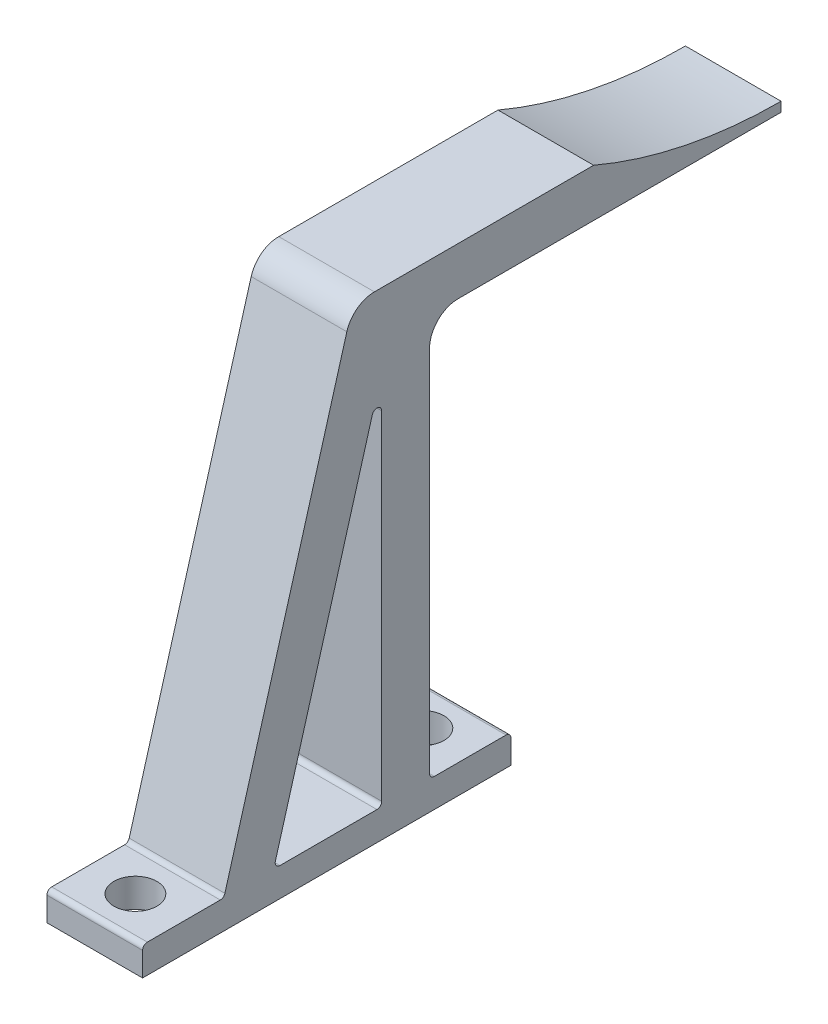
ISO-10303-21;
HEADER;
FILE_DESCRIPTION(('STEP AP214'),'2;1');
FILE_NAME('part.step','',(''),(''),'','','');
FILE_SCHEMA(('AUTOMOTIVE_DESIGN { 1 0 10303 214 1 1 1 1 }'));
ENDSEC;
DATA;
#1=APPLICATION_CONTEXT('core data for automotive mechanical design processes');
#2=APPLICATION_PROTOCOL_DEFINITION('international standard','automotive_design',2000,#1);
#3=PRODUCT_CONTEXT('',#1,'mechanical');
#4=PRODUCT('Part','Part','',(#3));
#5=PRODUCT_RELATED_PRODUCT_CATEGORY('part','',(#4));
#6=PRODUCT_DEFINITION_FORMATION('','',#4);
#7=PRODUCT_DEFINITION_CONTEXT('part definition',#1,'design');
#8=PRODUCT_DEFINITION('design','',#6,#7);
#9=PRODUCT_DEFINITION_SHAPE('','',#8);
#10=(LENGTH_UNIT() NAMED_UNIT(*) SI_UNIT(.MILLI.,.METRE.));
#11=(NAMED_UNIT(*) PLANE_ANGLE_UNIT() SI_UNIT($,.RADIAN.));
#12=(NAMED_UNIT(*) SI_UNIT($,.STERADIAN.) SOLID_ANGLE_UNIT());
#13=UNCERTAINTY_MEASURE_WITH_UNIT(LENGTH_MEASURE(1.E-05),#10,'distance_accuracy_value','');
#14=(GEOMETRIC_REPRESENTATION_CONTEXT(3) GLOBAL_UNCERTAINTY_ASSIGNED_CONTEXT((#13)) GLOBAL_UNIT_ASSIGNED_CONTEXT((#10,
#11,#12)) REPRESENTATION_CONTEXT('',''));
#15=CARTESIAN_POINT('',(0.,0.,0.));
#16=DIRECTION('',(0.,0.,1.));
#17=DIRECTION('',(1.,0.,0.));
#18=AXIS2_PLACEMENT_3D('',#15,#16,#17);
#19=CARTESIAN_POINT('',(10.,32.8701380885381,-10.8639818910002));
#20=DIRECTION('',(-1.,0.,0.));
#21=DIRECTION('',(0.,0.,1.));
#22=AXIS2_PLACEMENT_3D('',#19,#20,#21);
#23=PLANE('',#22);
#24=CARTESIAN_POINT('',(10.,32.8701380885381,-10.8639818910002));
#25=DIRECTION('',(-1.,0.,0.));
#26=DIRECTION('',(0.,0.,1.));
#27=AXIS2_PLACEMENT_3D('',#24,#25,#26);
#28=CIRCLE('',#27,3.);
#29=CARTESIAN_POINT('',(10.,33.6970501559891,-7.98019680318527));
#30=VERTEX_POINT('',#29);
#31=CARTESIAN_POINT('',(10.,35.8701380885381,-10.8639818910002));
#32=VERTEX_POINT('',#31);
#33=EDGE_CURVE('E243',#30,#32,#28,.T.);
#34=ORIENTED_EDGE('',*,*,#33,.F.);
#35=DIRECTION('',(0.,-0.96126169593832,0.275637355816996));
#36=VECTOR('',#35,1.);
#37=CARTESIAN_POINT('',(10.,33.6970501559891,-7.98019680318527));
#38=LINE('',#37,#36);
#39=CARTESIAN_POINT('',(10.,-10.7676805893704,4.7698595670542));
#40=VERTEX_POINT('',#39);
#41=EDGE_CURVE('E281',#30,#40,#38,.T.);
#42=ORIENTED_EDGE('',*,*,#41,.T.);
#43=CARTESIAN_POINT('',(10.,-10.6298619114619,5.25049041502336));
#44=DIRECTION('',(-1.,0.,0.));
#45=DIRECTION('',(0.,0.,1.));
#46=AXIS2_PLACEMENT_3D('',#43,#44,#45);
#47=CIRCLE('',#46,0.5);
#48=CARTESIAN_POINT('',(10.,-11.1298619114619,5.25049041502336));
#49=VERTEX_POINT('',#48);
#50=EDGE_CURVE('E279',#40,#49,#47,.T.);
#51=ORIENTED_EDGE('',*,*,#50,.T.);
#52=DIRECTION('',(0.,0.,1.));
#53=VECTOR('',#52,1.);
#54=CARTESIAN_POINT('',(10.,-11.1298619114619,5.25049041502336));
#55=LINE('',#54,#53);
#56=CARTESIAN_POINT('',(10.,-11.1298619114619,12.873713389972));
#57=VERTEX_POINT('',#56);
#58=EDGE_CURVE('E277',#49,#57,#55,.T.);
#59=ORIENTED_EDGE('',*,*,#58,.T.);
#60=CARTESIAN_POINT('',(10.,-11.6298619114619,12.873713389972));
#61=DIRECTION('',(1.,0.,0.));
#62=DIRECTION('',(0.,0.,-1.));
#63=AXIS2_PLACEMENT_3D('',#60,#61,#62);
#64=CIRCLE('',#63,0.500000000000001);
#65=CARTESIAN_POINT('',(10.,-11.6298619114619,13.373713389972));
#66=VERTEX_POINT('',#65);
#67=EDGE_CURVE('E275',#57,#66,#64,.T.);
#68=ORIENTED_EDGE('',*,*,#67,.T.);
#69=DIRECTION('',(0.,-1.,0.));
#70=VECTOR('',#69,1.);
#71=CARTESIAN_POINT('',(10.,-11.6298619114619,13.373713389972));
#72=LINE('',#71,#70);
#73=CARTESIAN_POINT('',(10.,-14.1298619114619,13.373713389972));
#74=VERTEX_POINT('',#73);
#75=EDGE_CURVE('E273',#66,#74,#72,.T.);
#76=ORIENTED_EDGE('',*,*,#75,.T.);
#77=DIRECTION('',(0.,0.,-1.));
#78=VECTOR('',#77,1.);
#79=CARTESIAN_POINT('',(10.,-14.1298619114619,13.373713389972));
#80=LINE('',#79,#78);
#81=CARTESIAN_POINT('',(10.,-14.1298619114619,-25.126286610028));
#82=VERTEX_POINT('',#81);
#83=EDGE_CURVE('E271',#74,#82,#80,.T.);
#84=ORIENTED_EDGE('',*,*,#83,.T.);
#85=DIRECTION('',(0.,1.,0.));
#86=VECTOR('',#85,1.);
#87=CARTESIAN_POINT('',(10.,-14.1298619114619,-25.126286610028));
#88=LINE('',#87,#86);
#89=CARTESIAN_POINT('',(10.,-11.6298619114619,-25.126286610028));
#90=VERTEX_POINT('',#89);
#91=EDGE_CURVE('E269',#82,#90,#88,.T.);
#92=ORIENTED_EDGE('',*,*,#91,.T.);
#93=CARTESIAN_POINT('',(10.,-11.6298619114619,-24.626286610028));
#94=DIRECTION('',(1.,0.,0.));
#95=DIRECTION('',(0.,0.,-1.));
#96=AXIS2_PLACEMENT_3D('',#93,#94,#95);
#97=CIRCLE('',#96,0.500000000000002);
#98=CARTESIAN_POINT('',(10.,-11.1298619114619,-24.626286610028));
#99=VERTEX_POINT('',#98);
#100=EDGE_CURVE('E267',#90,#99,#97,.T.);
#101=ORIENTED_EDGE('',*,*,#100,.T.);
#102=DIRECTION('',(0.,0.,1.));
#103=VECTOR('',#102,1.);
#104=CARTESIAN_POINT('',(10.,-11.1298619114619,-24.626286610028));
#105=LINE('',#104,#103);
#106=CARTESIAN_POINT('',(10.,-11.1298619114619,-17.126286610028));
#107=VERTEX_POINT('',#106);
#108=EDGE_CURVE('E265',#99,#107,#105,.T.);
#109=ORIENTED_EDGE('',*,*,#108,.T.);
#110=CARTESIAN_POINT('',(10.,-10.6298619114619,-17.126286610028));
#111=DIRECTION('',(-1.,0.,0.));
#112=DIRECTION('',(0.,0.,1.));
#113=AXIS2_PLACEMENT_3D('',#110,#111,#112);
#114=CIRCLE('',#113,0.5);
#115=CARTESIAN_POINT('',(10.,-10.6298619114619,-16.626286610028));
#116=VERTEX_POINT('',#115);
#117=EDGE_CURVE('E263',#107,#116,#114,.T.);
#118=ORIENTED_EDGE('',*,*,#117,.T.);
#119=DIRECTION('',(0.,1.,0.));
#120=VECTOR('',#119,1.);
#121=CARTESIAN_POINT('',(10.,-10.6298619114619,-16.626286610028));
#122=LINE('',#121,#120);
#123=CARTESIAN_POINT('',(10.,27.8701380885381,-16.626286610028));
#124=VERTEX_POINT('',#123);
#125=EDGE_CURVE('E261',#116,#124,#122,.T.);
#126=ORIENTED_EDGE('',*,*,#125,.T.);
#127=CARTESIAN_POINT('',(10.,27.8701380885381,-19.626286610028));
#128=DIRECTION('',(1.,0.,0.));
#129=DIRECTION('',(0.,0.,-1.));
#130=AXIS2_PLACEMENT_3D('',#127,#128,#129);
#131=CIRCLE('',#130,3.);
#132=CARTESIAN_POINT('',(10.,30.8701380885381,-19.6262866100281));
#133=VERTEX_POINT('',#132);
#134=EDGE_CURVE('E258',#133,#124,#131,.T.);
#135=ORIENTED_EDGE('',*,*,#134,.F.);
#136=DIRECTION('',(0.,0.,1.));
#137=VECTOR('',#136,1.);
#138=CARTESIAN_POINT('',(10.,30.8701380885381,-53.376286610028));
#139=LINE('',#138,#137);
#140=CARTESIAN_POINT('',(10.,30.8701380885381,-53.376286610028));
#141=VERTEX_POINT('',#140);
#142=EDGE_CURVE('E255',#141,#133,#139,.T.);
#143=ORIENTED_EDGE('',*,*,#142,.F.);
#144=DIRECTION('',(0.,-1.,0.));
#145=VECTOR('',#144,1.);
#146=CARTESIAN_POINT('',(10.,31.8701380885381,-53.376286610028));
#147=LINE('',#146,#145);
#148=CARTESIAN_POINT('',(10.,31.8701380885381,-53.376286610028));
#149=VERTEX_POINT('',#148);
#150=EDGE_CURVE('E252',#149,#141,#147,.T.);
#151=ORIENTED_EDGE('',*,*,#150,.F.);
#152=CARTESIAN_POINT('',(10.,81.8701380885381,-53.376286610028));
#153=DIRECTION('',(-1.,0.,0.));
#154=DIRECTION('',(0.,0.,1.));
#155=AXIS2_PLACEMENT_3D('',#152,#153,#154);
#156=CIRCLE('',#155,50.);
#157=CARTESIAN_POINT('',(10.,35.8701380885381,-33.7803686677627));
#158=VERTEX_POINT('',#157);
#159=EDGE_CURVE('E250',#149,#158,#156,.T.);
#160=ORIENTED_EDGE('',*,*,#159,.T.);
#161=DIRECTION('',(0.,0.,-1.));
#162=VECTOR('',#161,1.);
#163=CARTESIAN_POINT('',(10.,35.8701380885381,-10.8639818910002));
#164=LINE('',#163,#162);
#165=EDGE_CURVE('E246',#32,#158,#164,.T.);
#166=ORIENTED_EDGE('',*,*,#165,.F.);
#167=EDGE_LOOP('',(#34,#42,#51,#59,#68,#76,#84,#92,#101,#109,#118,#126,#135,#143,#151,#160,#166));
#168=FACE_BOUND('',#167,.T.);
#169=CARTESIAN_POINT('',(10.,-10.6298619114619,-0.991306200146249));
#170=DIRECTION('',(1.,0.,0.));
#171=DIRECTION('',(0.,0.,1.));
#172=AXIS2_PLACEMENT_3D('',#169,#170,#171);
#173=CIRCLE('',#172,0.5);
#174=CARTESIAN_POINT('',(10.,-10.4920432335534,-0.510675352177089));
#175=VERTEX_POINT('',#174);
#176=CARTESIAN_POINT('',(10.,-11.1298619114619,-0.991306200146249));
#177=VERTEX_POINT('',#176);
#178=EDGE_CURVE('E190',#175,#177,#173,.T.);
#179=ORIENTED_EDGE('',*,*,#178,.F.);
#180=DIRECTION('',(0.,-0.96126169593832,0.275637355816996));
#181=VECTOR('',#180,1.);
#182=CARTESIAN_POINT('',(10.,24.8528338359134,-10.6456557620589));
#183=LINE('',#182,#181);
#184=CARTESIAN_POINT('',(10.,24.8528338359134,-10.6456557620589));
#185=VERTEX_POINT('',#184);
#186=EDGE_CURVE('E220',#185,#175,#183,.T.);
#187=ORIENTED_EDGE('',*,*,#186,.F.);
#188=CARTESIAN_POINT('',(10.,24.715015158005,-11.126286610028));
#189=DIRECTION('',(1.,0.,0.));
#190=DIRECTION('',(0.,0.,-1.));
#191=AXIS2_PLACEMENT_3D('',#188,#189,#190);
#192=CIRCLE('',#191,0.5);
#193=CARTESIAN_POINT('',(10.,24.7150151580049,-11.626286610028));
#194=VERTEX_POINT('',#193);
#195=EDGE_CURVE('E218',#194,#185,#192,.T.);
#196=ORIENTED_EDGE('',*,*,#195,.F.);
#197=DIRECTION('',(0.,1.,0.));
#198=VECTOR('',#197,1.);
#199=CARTESIAN_POINT('',(10.,-10.6298619114619,-11.626286610028));
#200=LINE('',#199,#198);
#201=CARTESIAN_POINT('',(10.,-10.6298619114619,-11.626286610028));
#202=VERTEX_POINT('',#201);
#203=EDGE_CURVE('E213',#202,#194,#200,.T.);
#204=ORIENTED_EDGE('',*,*,#203,.F.);
#205=CARTESIAN_POINT('',(10.,-10.6298619114619,-11.126286610028));
#206=DIRECTION('',(1.,0.,0.));
#207=DIRECTION('',(0.,0.,-1.));
#208=AXIS2_PLACEMENT_3D('',#205,#206,#207);
#209=CIRCLE('',#208,0.5);
#210=CARTESIAN_POINT('',(10.,-11.1298619114619,-11.126286610028));
#211=VERTEX_POINT('',#210);
#212=EDGE_CURVE('E211',#211,#202,#209,.T.);
#213=ORIENTED_EDGE('',*,*,#212,.F.);
#214=DIRECTION('',(0.,0.,-1.));
#215=VECTOR('',#214,1.);
#216=CARTESIAN_POINT('',(10.,-11.1298619114619,-0.991306200146249));
#217=LINE('',#216,#215);
#218=EDGE_CURVE('E198',#177,#211,#217,.T.);
#219=ORIENTED_EDGE('',*,*,#218,.F.);
#220=EDGE_LOOP('',(#179,#187,#196,#204,#213,#219));
#221=FACE_BOUND('',#220,.T.);
#222=ADVANCED_FACE('F34',(#168,#221),#23,.F.);
#223=CARTESIAN_POINT('',(0.,32.8701380885381,-10.8639818910002));
#224=DIRECTION('',(-1.,0.,0.));
#225=DIRECTION('',(0.,0.,1.));
#226=AXIS2_PLACEMENT_3D('',#223,#224,#225);
#227=PLANE('',#226);
#228=CARTESIAN_POINT('',(0.,32.8701380885381,-10.8639818910002));
#229=DIRECTION('',(-1.,0.,0.));
#230=DIRECTION('',(0.,0.,1.));
#231=AXIS2_PLACEMENT_3D('',#228,#229,#230);
#232=CIRCLE('',#231,3.);
#233=CARTESIAN_POINT('',(0.,33.6970501559891,-7.98019680318527));
#234=VERTEX_POINT('',#233);
#235=CARTESIAN_POINT('',(0.,35.8701380885381,-10.8639818910002));
#236=VERTEX_POINT('',#235);
#237=EDGE_CURVE('E206',#234,#236,#232,.T.);
#238=ORIENTED_EDGE('',*,*,#237,.T.);
#239=DIRECTION('',(0.,0.,-1.));
#240=VECTOR('',#239,1.);
#241=CARTESIAN_POINT('',(0.,35.8701380885381,-10.8639818910002));
#242=LINE('',#241,#240);
#243=CARTESIAN_POINT('',(0.,35.8701380885381,-33.7803686677627));
#244=VERTEX_POINT('',#243);
#245=EDGE_CURVE('E286',#236,#244,#242,.T.);
#246=ORIENTED_EDGE('',*,*,#245,.T.);
#247=CARTESIAN_POINT('',(0.,81.8701380885381,-53.376286610028));
#248=DIRECTION('',(-1.,0.,0.));
#249=DIRECTION('',(0.,0.,1.));
#250=AXIS2_PLACEMENT_3D('',#247,#248,#249);
#251=CIRCLE('',#250,50.);
#252=CARTESIAN_POINT('',(0.,31.8701380885381,-53.376286610028));
#253=VERTEX_POINT('',#252);
#254=EDGE_CURVE('E289',#253,#244,#251,.T.);
#255=ORIENTED_EDGE('',*,*,#254,.F.);
#256=DIRECTION('',(0.,-1.,0.));
#257=VECTOR('',#256,1.);
#258=CARTESIAN_POINT('',(0.,31.8701380885381,-53.376286610028));
#259=LINE('',#258,#257);
#260=CARTESIAN_POINT('',(0.,30.8701380885381,-53.376286610028));
#261=VERTEX_POINT('',#260);
#262=EDGE_CURVE('E292',#253,#261,#259,.T.);
#263=ORIENTED_EDGE('',*,*,#262,.T.);
#264=DIRECTION('',(0.,0.,1.));
#265=VECTOR('',#264,1.);
#266=CARTESIAN_POINT('',(0.,30.8701380885381,-53.376286610028));
#267=LINE('',#266,#265);
#268=CARTESIAN_POINT('',(0.,30.8701380885381,-19.6262866100281));
#269=VERTEX_POINT('',#268);
#270=EDGE_CURVE('E295',#261,#269,#267,.T.);
#271=ORIENTED_EDGE('',*,*,#270,.T.);
#272=CARTESIAN_POINT('',(0.,27.8701380885381,-19.626286610028));
#273=DIRECTION('',(1.,0.,0.));
#274=DIRECTION('',(0.,0.,-1.));
#275=AXIS2_PLACEMENT_3D('',#272,#273,#274);
#276=CIRCLE('',#275,3.);
#277=CARTESIAN_POINT('',(0.,27.8701380885381,-16.626286610028));
#278=VERTEX_POINT('',#277);
#279=EDGE_CURVE('E298',#269,#278,#276,.T.);
#280=ORIENTED_EDGE('',*,*,#279,.T.);
#281=DIRECTION('',(0.,1.,0.));
#282=VECTOR('',#281,1.);
#283=CARTESIAN_POINT('',(0.,-10.6298619114619,-16.626286610028));
#284=LINE('',#283,#282);
#285=CARTESIAN_POINT('',(0.,-10.6298619114619,-16.626286610028));
#286=VERTEX_POINT('',#285);
#287=EDGE_CURVE('E301',#286,#278,#284,.T.);
#288=ORIENTED_EDGE('',*,*,#287,.F.);
#289=CARTESIAN_POINT('',(0.,-10.6298619114619,-17.126286610028));
#290=DIRECTION('',(-1.,0.,0.));
#291=DIRECTION('',(0.,0.,1.));
#292=AXIS2_PLACEMENT_3D('',#289,#290,#291);
#293=CIRCLE('',#292,0.5);
#294=CARTESIAN_POINT('',(0.,-11.1298619114619,-17.126286610028));
#295=VERTEX_POINT('',#294);
#296=EDGE_CURVE('E304',#295,#286,#293,.T.);
#297=ORIENTED_EDGE('',*,*,#296,.F.);
#298=DIRECTION('',(0.,0.,1.));
#299=VECTOR('',#298,1.);
#300=CARTESIAN_POINT('',(0.,-11.1298619114619,-24.626286610028));
#301=LINE('',#300,#299);
#302=CARTESIAN_POINT('',(0.,-11.1298619114619,-24.626286610028));
#303=VERTEX_POINT('',#302);
#304=EDGE_CURVE('E306',#303,#295,#301,.T.);
#305=ORIENTED_EDGE('',*,*,#304,.F.);
#306=CARTESIAN_POINT('',(0.,-11.6298619114619,-24.626286610028));
#307=DIRECTION('',(1.,0.,0.));
#308=DIRECTION('',(0.,0.,-1.));
#309=AXIS2_PLACEMENT_3D('',#306,#307,#308);
#310=CIRCLE('',#309,0.500000000000002);
#311=CARTESIAN_POINT('',(0.,-11.6298619114619,-25.126286610028));
#312=VERTEX_POINT('',#311);
#313=EDGE_CURVE('E308',#312,#303,#310,.T.);
#314=ORIENTED_EDGE('',*,*,#313,.F.);
#315=DIRECTION('',(0.,1.,0.));
#316=VECTOR('',#315,1.);
#317=CARTESIAN_POINT('',(0.,-14.1298619114619,-25.126286610028));
#318=LINE('',#317,#316);
#319=CARTESIAN_POINT('',(0.,-14.1298619114619,-25.126286610028));
#320=VERTEX_POINT('',#319);
#321=EDGE_CURVE('E310',#320,#312,#318,.T.);
#322=ORIENTED_EDGE('',*,*,#321,.F.);
#323=DIRECTION('',(0.,0.,-1.));
#324=VECTOR('',#323,1.);
#325=CARTESIAN_POINT('',(0.,-14.1298619114619,13.373713389972));
#326=LINE('',#325,#324);
#327=CARTESIAN_POINT('',(0.,-14.1298619114619,13.373713389972));
#328=VERTEX_POINT('',#327);
#329=EDGE_CURVE('E312',#328,#320,#326,.T.);
#330=ORIENTED_EDGE('',*,*,#329,.F.);
#331=DIRECTION('',(0.,-1.,0.));
#332=VECTOR('',#331,1.);
#333=CARTESIAN_POINT('',(0.,-11.6298619114619,13.373713389972));
#334=LINE('',#333,#332);
#335=CARTESIAN_POINT('',(0.,-11.6298619114619,13.373713389972));
#336=VERTEX_POINT('',#335);
#337=EDGE_CURVE('E314',#336,#328,#334,.T.);
#338=ORIENTED_EDGE('',*,*,#337,.F.);
#339=CARTESIAN_POINT('',(0.,-11.6298619114619,12.873713389972));
#340=DIRECTION('',(1.,0.,0.));
#341=DIRECTION('',(0.,0.,-1.));
#342=AXIS2_PLACEMENT_3D('',#339,#340,#341);
#343=CIRCLE('',#342,0.500000000000001);
#344=CARTESIAN_POINT('',(0.,-11.1298619114619,12.873713389972));
#345=VERTEX_POINT('',#344);
#346=EDGE_CURVE('E316',#345,#336,#343,.T.);
#347=ORIENTED_EDGE('',*,*,#346,.F.);
#348=DIRECTION('',(0.,0.,1.));
#349=VECTOR('',#348,1.);
#350=CARTESIAN_POINT('',(0.,-11.1298619114619,5.25049041502336));
#351=LINE('',#350,#349);
#352=CARTESIAN_POINT('',(0.,-11.1298619114619,5.25049041502336));
#353=VERTEX_POINT('',#352);
#354=EDGE_CURVE('E318',#353,#345,#351,.T.);
#355=ORIENTED_EDGE('',*,*,#354,.F.);
#356=CARTESIAN_POINT('',(0.,-10.6298619114619,5.25049041502336));
#357=DIRECTION('',(-1.,0.,0.));
#358=DIRECTION('',(0.,0.,1.));
#359=AXIS2_PLACEMENT_3D('',#356,#357,#358);
#360=CIRCLE('',#359,0.5);
#361=CARTESIAN_POINT('',(0.,-10.7676805893704,4.7698595670542));
#362=VERTEX_POINT('',#361);
#363=EDGE_CURVE('E320',#362,#353,#360,.T.);
#364=ORIENTED_EDGE('',*,*,#363,.F.);
#365=DIRECTION('',(0.,-0.96126169593832,0.275637355816996));
#366=VECTOR('',#365,1.);
#367=CARTESIAN_POINT('',(0.,33.6970501559891,-7.98019680318527));
#368=LINE('',#367,#366);
#369=EDGE_CURVE('E247',#234,#362,#368,.T.);
#370=ORIENTED_EDGE('',*,*,#369,.F.);
#371=EDGE_LOOP('',(#238,#246,#255,#263,#271,#280,#288,#297,#305,#314,#322,#330,#338,#347,#355,
#364,#370));
#372=FACE_BOUND('',#371,.T.);
#373=DIRECTION('',(0.,-0.96126169593832,0.275637355816996));
#374=VECTOR('',#373,1.);
#375=CARTESIAN_POINT('',(0.,24.8528338359134,-10.6456557620589));
#376=LINE('',#375,#374);
#377=CARTESIAN_POINT('',(0.,24.8528338359134,-10.6456557620589));
#378=VERTEX_POINT('',#377);
#379=CARTESIAN_POINT('',(0.,-10.4920432335534,-0.510675352177086));
#380=VERTEX_POINT('',#379);
#381=EDGE_CURVE('E199',#378,#380,#376,.T.);
#382=ORIENTED_EDGE('',*,*,#381,.T.);
#383=CARTESIAN_POINT('',(0.,-10.6298619114619,-0.991306200146249));
#384=DIRECTION('',(1.,0.,0.));
#385=DIRECTION('',(0.,0.,1.));
#386=AXIS2_PLACEMENT_3D('',#383,#384,#385);
#387=CIRCLE('',#386,0.5);
#388=CARTESIAN_POINT('',(0.,-11.1298619114619,-0.991306200146249));
#389=VERTEX_POINT('',#388);
#390=EDGE_CURVE('E59',#380,#389,#387,.T.);
#391=ORIENTED_EDGE('',*,*,#390,.T.);
#392=DIRECTION('',(0.,0.,-1.));
#393=VECTOR('',#392,1.);
#394=CARTESIAN_POINT('',(0.,-11.1298619114619,-0.991306200146249));
#395=LINE('',#394,#393);
#396=CARTESIAN_POINT('',(0.,-11.1298619114619,-11.126286610028));
#397=VERTEX_POINT('',#396);
#398=EDGE_CURVE('E205',#389,#397,#395,.T.);
#399=ORIENTED_EDGE('',*,*,#398,.T.);
#400=CARTESIAN_POINT('',(0.,-10.6298619114619,-11.126286610028));
#401=DIRECTION('',(1.,0.,0.));
#402=DIRECTION('',(0.,0.,-1.));
#403=AXIS2_PLACEMENT_3D('',#400,#401,#402);
#404=CIRCLE('',#403,0.5);
#405=CARTESIAN_POINT('',(0.,-10.6298619114619,-11.626286610028));
#406=VERTEX_POINT('',#405);
#407=EDGE_CURVE('E225',#397,#406,#404,.T.);
#408=ORIENTED_EDGE('',*,*,#407,.T.);
#409=DIRECTION('',(0.,1.,0.));
#410=VECTOR('',#409,1.);
#411=CARTESIAN_POINT('',(0.,-10.6298619114619,-11.626286610028));
#412=LINE('',#411,#410);
#413=CARTESIAN_POINT('',(0.,24.7150151580049,-11.626286610028));
#414=VERTEX_POINT('',#413);
#415=EDGE_CURVE('E228',#406,#414,#412,.T.);
#416=ORIENTED_EDGE('',*,*,#415,.T.);
#417=CARTESIAN_POINT('',(0.,24.715015158005,-11.126286610028));
#418=DIRECTION('',(1.,0.,0.));
#419=DIRECTION('',(0.,0.,-1.));
#420=AXIS2_PLACEMENT_3D('',#417,#418,#419);
#421=CIRCLE('',#420,0.5);
#422=EDGE_CURVE('E231',#414,#378,#421,.T.);
#423=ORIENTED_EDGE('',*,*,#422,.T.);
#424=EDGE_LOOP('',(#382,#391,#399,#408,#416,#423));
#425=FACE_BOUND('',#424,.T.);
#426=ADVANCED_FACE('F372',(#372,#425),#227,.T.);
#427=CARTESIAN_POINT('',(10.,32.8701380885381,-10.8639818910002));
#428=DIRECTION('',(-1.,0.,0.));
#429=DIRECTION('',(0.,0.,1.));
#430=AXIS2_PLACEMENT_3D('',#427,#428,#429);
#431=CYLINDRICAL_SURFACE('',#430,3.);
#432=ORIENTED_EDGE('',*,*,#237,.F.);
#433=DIRECTION('',(-1.,0.,0.));
#434=VECTOR('',#433,1.);
#435=CARTESIAN_POINT('',(10.,33.6970501559891,-7.98019680318527));
#436=LINE('',#435,#434);
#437=EDGE_CURVE('E12',#30,#234,#436,.T.);
#438=ORIENTED_EDGE('',*,*,#437,.F.);
#439=ORIENTED_EDGE('',*,*,#33,.T.);
#440=DIRECTION('',(-1.,0.,0.));
#441=VECTOR('',#440,1.);
#442=CARTESIAN_POINT('',(10.,35.8701380885381,-10.8639818910002));
#443=LINE('',#442,#441);
#444=EDGE_CURVE('E283',#32,#236,#443,.T.);
#445=ORIENTED_EDGE('',*,*,#444,.T.);
#446=EDGE_LOOP('',(#432,#438,#439,#445));
#447=FACE_BOUND('',#446,.T.);
#448=ADVANCED_FACE('F36',(#447),#431,.T.);
#449=CARTESIAN_POINT('',(10.,33.6970501559891,-7.98019680318527));
#450=DIRECTION('',(0.,-0.275637355816996,-0.96126169593832));
#451=DIRECTION('',(0.,0.96126169593832,-0.275637355816996));
#452=AXIS2_PLACEMENT_3D('',#449,#450,#451);
#453=PLANE('',#452);
#454=ORIENTED_EDGE('',*,*,#369,.T.);
#455=DIRECTION('',(-1.,0.,0.));
#456=VECTOR('',#455,1.);
#457=CARTESIAN_POINT('',(10.,-10.7676805893704,4.7698595670542));
#458=LINE('',#457,#456);
#459=EDGE_CURVE('E43',#40,#362,#458,.T.);
#460=ORIENTED_EDGE('',*,*,#459,.F.);
#461=ORIENTED_EDGE('',*,*,#41,.F.);
#462=ORIENTED_EDGE('',*,*,#437,.T.);
#463=EDGE_LOOP('',(#454,#460,#461,#462));
#464=FACE_BOUND('',#463,.T.);
#465=ADVANCED_FACE('F378',(#464),#453,.F.);
#466=CARTESIAN_POINT('',(10.,-10.6298619114619,5.25049041502336));
#467=DIRECTION('',(-1.,0.,0.));
#468=DIRECTION('',(0.,0.,1.));
#469=AXIS2_PLACEMENT_3D('',#466,#467,#468);
#470=CYLINDRICAL_SURFACE('',#469,0.5);
#471=ORIENTED_EDGE('',*,*,#363,.T.);
#472=DIRECTION('',(-1.,0.,0.));
#473=VECTOR('',#472,1.);
#474=CARTESIAN_POINT('',(10.,-11.1298619114619,5.25049041502336));
#475=LINE('',#474,#473);
#476=EDGE_CURVE('E325',#49,#353,#475,.T.);
#477=ORIENTED_EDGE('',*,*,#476,.F.);
#478=ORIENTED_EDGE('',*,*,#50,.F.);
#479=ORIENTED_EDGE('',*,*,#459,.T.);
#480=EDGE_LOOP('',(#471,#477,#478,#479));
#481=FACE_BOUND('',#480,.T.);
#482=ADVANCED_FACE('F382',(#481),#470,.F.);
#483=CARTESIAN_POINT('',(10.,-11.1298619114619,5.25049041502336));
#484=DIRECTION('',(0.,-1.,0.));
#485=DIRECTION('',(0.,0.,-1.));
#486=AXIS2_PLACEMENT_3D('',#483,#484,#485);
#487=PLANE('',#486);
#488=CARTESIAN_POINT('',(5.,-11.1298619114619,9.12371338997196));
#489=DIRECTION('',(0.,-1.,0.));
#490=DIRECTION('',(0.,0.,-1.));
#491=AXIS2_PLACEMENT_3D('',#488,#489,#490);
#492=CIRCLE('',#491,2.25);
#493=CARTESIAN_POINT('',(5.,-11.1298619114619,6.87371338997195));
#494=VERTEX_POINT('',#493);
#495=EDGE_CURVE('E223',#494,#494,#492,.T.);
#496=ORIENTED_EDGE('',*,*,#495,.T.);
#497=EDGE_LOOP('',(#496));
#498=FACE_BOUND('',#497,.T.);
#499=ORIENTED_EDGE('',*,*,#354,.T.);
#500=DIRECTION('',(-1.,0.,0.));
#501=VECTOR('',#500,1.);
#502=CARTESIAN_POINT('',(10.,-11.1298619114619,12.873713389972));
#503=LINE('',#502,#501);
#504=EDGE_CURVE('E328',#57,#345,#503,.T.);
#505=ORIENTED_EDGE('',*,*,#504,.F.);
#506=ORIENTED_EDGE('',*,*,#58,.F.);
#507=ORIENTED_EDGE('',*,*,#476,.T.);
#508=EDGE_LOOP('',(#499,#505,#506,#507));
#509=FACE_BOUND('',#508,.T.);
#510=ADVANCED_FACE('F443',(#498,#509),#487,.F.);
#511=CARTESIAN_POINT('',(10.,-11.6298619114619,12.873713389972));
#512=DIRECTION('',(-1.,0.,0.));
#513=DIRECTION('',(0.,0.,1.));
#514=AXIS2_PLACEMENT_3D('',#511,#512,#513);
#515=CYLINDRICAL_SURFACE('',#514,0.500000000000001);
#516=ORIENTED_EDGE('',*,*,#346,.T.);
#517=DIRECTION('',(-1.,0.,0.));
#518=VECTOR('',#517,1.);
#519=CARTESIAN_POINT('',(10.,-11.6298619114619,13.373713389972));
#520=LINE('',#519,#518);
#521=EDGE_CURVE('E331',#66,#336,#520,.T.);
#522=ORIENTED_EDGE('',*,*,#521,.F.);
#523=ORIENTED_EDGE('',*,*,#67,.F.);
#524=ORIENTED_EDGE('',*,*,#504,.T.);
#525=EDGE_LOOP('',(#516,#522,#523,#524));
#526=FACE_BOUND('',#525,.T.);
#527=ADVANCED_FACE('F441',(#526),#515,.T.);
#528=CARTESIAN_POINT('',(10.,-11.6298619114619,13.373713389972));
#529=DIRECTION('',(0.,0.,-1.));
#530=DIRECTION('',(-1.,0.,0.));
#531=AXIS2_PLACEMENT_3D('',#528,#529,#530);
#532=PLANE('',#531);
#533=ORIENTED_EDGE('',*,*,#337,.T.);
#534=DIRECTION('',(-1.,0.,0.));
#535=VECTOR('',#534,1.);
#536=CARTESIAN_POINT('',(10.,-14.1298619114619,13.373713389972));
#537=LINE('',#536,#535);
#538=EDGE_CURVE('E334',#74,#328,#537,.T.);
#539=ORIENTED_EDGE('',*,*,#538,.F.);
#540=ORIENTED_EDGE('',*,*,#75,.F.);
#541=ORIENTED_EDGE('',*,*,#521,.T.);
#542=EDGE_LOOP('',(#533,#539,#540,#541));
#543=FACE_BOUND('',#542,.T.);
#544=ADVANCED_FACE('F437',(#543),#532,.F.);
#545=CARTESIAN_POINT('',(10.,-14.1298619114619,13.373713389972));
#546=DIRECTION('',(0.,1.,0.));
#547=DIRECTION('',(0.,0.,1.));
#548=AXIS2_PLACEMENT_3D('',#545,#546,#547);
#549=PLANE('',#548);
#550=CARTESIAN_POINT('',(5.,-14.1298619114619,-20.876286610028));
#551=DIRECTION('',(0.,-1.,0.));
#552=DIRECTION('',(0.,0.,-1.));
#553=AXIS2_PLACEMENT_3D('',#550,#551,#552);
#554=CIRCLE('',#553,2.25);
#555=CARTESIAN_POINT('',(5.,-14.1298619114619,-23.1262866100281));
#556=VERTEX_POINT('',#555);
#557=EDGE_CURVE('E590',#556,#556,#554,.T.);
#558=ORIENTED_EDGE('',*,*,#557,.F.);
#559=EDGE_LOOP('',(#558));
#560=FACE_BOUND('',#559,.T.);
#561=CARTESIAN_POINT('',(5.,-14.1298619114619,9.12371338997196));
#562=DIRECTION('',(0.,-1.,0.));
#563=DIRECTION('',(0.,0.,-1.));
#564=AXIS2_PLACEMENT_3D('',#561,#562,#563);
#565=CIRCLE('',#564,2.25);
#566=CARTESIAN_POINT('',(5.,-14.1298619114619,6.87371338997195));
#567=VERTEX_POINT('',#566);
#568=EDGE_CURVE('E593',#567,#567,#565,.T.);
#569=ORIENTED_EDGE('',*,*,#568,.F.);
#570=EDGE_LOOP('',(#569));
#571=FACE_BOUND('',#570,.T.);
#572=ORIENTED_EDGE('',*,*,#329,.T.);
#573=DIRECTION('',(-1.,0.,0.));
#574=VECTOR('',#573,1.);
#575=CARTESIAN_POINT('',(10.,-14.1298619114619,-25.126286610028));
#576=LINE('',#575,#574);
#577=EDGE_CURVE('E337',#82,#320,#576,.T.);
#578=ORIENTED_EDGE('',*,*,#577,.F.);
#579=ORIENTED_EDGE('',*,*,#83,.F.);
#580=ORIENTED_EDGE('',*,*,#538,.T.);
#581=EDGE_LOOP('',(#572,#578,#579,#580));
#582=FACE_BOUND('',#581,.T.);
#583=ADVANCED_FACE('F432',(#560,#571,#582),#549,.F.);
#584=CARTESIAN_POINT('',(10.,-14.1298619114619,-25.126286610028));
#585=DIRECTION('',(0.,0.,1.));
#586=DIRECTION('',(1.,0.,0.));
#587=AXIS2_PLACEMENT_3D('',#584,#585,#586);
#588=PLANE('',#587);
#589=ORIENTED_EDGE('',*,*,#321,.T.);
#590=DIRECTION('',(-1.,0.,0.));
#591=VECTOR('',#590,1.);
#592=CARTESIAN_POINT('',(10.,-11.6298619114619,-25.126286610028));
#593=LINE('',#592,#591);
#594=EDGE_CURVE('E340',#90,#312,#593,.T.);
#595=ORIENTED_EDGE('',*,*,#594,.F.);
#596=ORIENTED_EDGE('',*,*,#91,.F.);
#597=ORIENTED_EDGE('',*,*,#577,.T.);
#598=EDGE_LOOP('',(#589,#595,#596,#597));
#599=FACE_BOUND('',#598,.T.);
#600=ADVANCED_FACE('F426',(#599),#588,.F.);
#601=CARTESIAN_POINT('',(10.,-11.6298619114619,-24.626286610028));
#602=DIRECTION('',(-1.,0.,0.));
#603=DIRECTION('',(0.,0.,1.));
#604=AXIS2_PLACEMENT_3D('',#601,#602,#603);
#605=CYLINDRICAL_SURFACE('',#604,0.500000000000002);
#606=ORIENTED_EDGE('',*,*,#313,.T.);
#607=DIRECTION('',(-1.,0.,0.));
#608=VECTOR('',#607,1.);
#609=CARTESIAN_POINT('',(10.,-11.1298619114619,-24.626286610028));
#610=LINE('',#609,#608);
#611=EDGE_CURVE('E343',#99,#303,#610,.T.);
#612=ORIENTED_EDGE('',*,*,#611,.F.);
#613=ORIENTED_EDGE('',*,*,#100,.F.);
#614=ORIENTED_EDGE('',*,*,#594,.T.);
#615=EDGE_LOOP('',(#606,#612,#613,#614));
#616=FACE_BOUND('',#615,.T.);
#617=ADVANCED_FACE('F422',(#616),#605,.T.);
#618=CARTESIAN_POINT('',(10.,-11.1298619114619,-24.626286610028));
#619=DIRECTION('',(0.,-1.,0.));
#620=DIRECTION('',(0.,0.,-1.));
#621=AXIS2_PLACEMENT_3D('',#618,#619,#620);
#622=PLANE('',#621);
#623=CARTESIAN_POINT('',(5.,-11.1298619114619,-20.876286610028));
#624=DIRECTION('',(0.,-1.,0.));
#625=DIRECTION('',(0.,0.,-1.));
#626=AXIS2_PLACEMENT_3D('',#623,#624,#625);
#627=CIRCLE('',#626,2.25);
#628=CARTESIAN_POINT('',(5.,-11.1298619114619,-23.1262866100281));
#629=VERTEX_POINT('',#628);
#630=EDGE_CURVE('E38',#629,#629,#627,.T.);
#631=ORIENTED_EDGE('',*,*,#630,.T.);
#632=EDGE_LOOP('',(#631));
#633=FACE_BOUND('',#632,.T.);
#634=ORIENTED_EDGE('',*,*,#304,.T.);
#635=DIRECTION('',(-1.,0.,0.));
#636=VECTOR('',#635,1.);
#637=CARTESIAN_POINT('',(10.,-11.1298619114619,-17.126286610028));
#638=LINE('',#637,#636);
#639=EDGE_CURVE('E346',#107,#295,#638,.T.);
#640=ORIENTED_EDGE('',*,*,#639,.F.);
#641=ORIENTED_EDGE('',*,*,#108,.F.);
#642=ORIENTED_EDGE('',*,*,#611,.T.);
#643=EDGE_LOOP('',(#634,#640,#641,#642));
#644=FACE_BOUND('',#643,.T.);
#645=ADVANCED_FACE('F417',(#633,#644),#622,.F.);
#646=CARTESIAN_POINT('',(10.,-10.6298619114619,-17.126286610028));
#647=DIRECTION('',(-1.,0.,0.));
#648=DIRECTION('',(0.,0.,1.));
#649=AXIS2_PLACEMENT_3D('',#646,#647,#648);
#650=CYLINDRICAL_SURFACE('',#649,0.5);
#651=ORIENTED_EDGE('',*,*,#296,.T.);
#652=DIRECTION('',(-1.,0.,0.));
#653=VECTOR('',#652,1.);
#654=CARTESIAN_POINT('',(10.,-10.6298619114619,-16.626286610028));
#655=LINE('',#654,#653);
#656=EDGE_CURVE('E349',#116,#286,#655,.T.);
#657=ORIENTED_EDGE('',*,*,#656,.F.);
#658=ORIENTED_EDGE('',*,*,#117,.F.);
#659=ORIENTED_EDGE('',*,*,#639,.T.);
#660=EDGE_LOOP('',(#651,#657,#658,#659));
#661=FACE_BOUND('',#660,.T.);
#662=ADVANCED_FACE('F411',(#661),#650,.F.);
#663=CARTESIAN_POINT('',(10.,-10.6298619114619,-16.626286610028));
#664=DIRECTION('',(0.,0.,1.));
#665=DIRECTION('',(0.,-1.,0.));
#666=AXIS2_PLACEMENT_3D('',#663,#664,#665);
#667=PLANE('',#666);
#668=ORIENTED_EDGE('',*,*,#287,.T.);
#669=DIRECTION('',(-1.,0.,0.));
#670=VECTOR('',#669,1.);
#671=CARTESIAN_POINT('',(10.,27.8701380885381,-16.626286610028));
#672=LINE('',#671,#670);
#673=EDGE_CURVE('E352',#124,#278,#672,.T.);
#674=ORIENTED_EDGE('',*,*,#673,.F.);
#675=ORIENTED_EDGE('',*,*,#125,.F.);
#676=ORIENTED_EDGE('',*,*,#656,.T.);
#677=EDGE_LOOP('',(#668,#674,#675,#676));
#678=FACE_BOUND('',#677,.T.);
#679=ADVANCED_FACE('F407',(#678),#667,.F.);
#680=CARTESIAN_POINT('',(10.,27.8701380885381,-19.626286610028));
#681=DIRECTION('',(-1.,0.,0.));
#682=DIRECTION('',(0.,0.,1.));
#683=AXIS2_PLACEMENT_3D('',#680,#681,#682);
#684=CYLINDRICAL_SURFACE('',#683,3.);
#685=ORIENTED_EDGE('',*,*,#279,.F.);
#686=DIRECTION('',(-1.,0.,0.));
#687=VECTOR('',#686,1.);
#688=CARTESIAN_POINT('',(10.,30.8701380885381,-19.6262866100281));
#689=LINE('',#688,#687);
#690=EDGE_CURVE('E354',#133,#269,#689,.T.);
#691=ORIENTED_EDGE('',*,*,#690,.F.);
#692=ORIENTED_EDGE('',*,*,#134,.T.);
#693=ORIENTED_EDGE('',*,*,#673,.T.);
#694=EDGE_LOOP('',(#685,#691,#692,#693));
#695=FACE_BOUND('',#694,.T.);
#696=ADVANCED_FACE('F402',(#695),#684,.F.);
#697=CARTESIAN_POINT('',(10.,30.8701380885381,-53.376286610028));
#698=DIRECTION('',(0.,-1.,0.));
#699=DIRECTION('',(0.,0.,-1.));
#700=AXIS2_PLACEMENT_3D('',#697,#698,#699);
#701=PLANE('',#700);
#702=ORIENTED_EDGE('',*,*,#270,.F.);
#703=DIRECTION('',(-1.,0.,0.));
#704=VECTOR('',#703,1.);
#705=CARTESIAN_POINT('',(10.,30.8701380885381,-53.376286610028));
#706=LINE('',#705,#704);
#707=EDGE_CURVE('E356',#141,#261,#706,.T.);
#708=ORIENTED_EDGE('',*,*,#707,.F.);
#709=ORIENTED_EDGE('',*,*,#142,.T.);
#710=ORIENTED_EDGE('',*,*,#690,.T.);
#711=EDGE_LOOP('',(#702,#708,#709,#710));
#712=FACE_BOUND('',#711,.T.);
#713=ADVANCED_FACE('F397',(#712),#701,.T.);
#714=CARTESIAN_POINT('',(10.,31.8701380885381,-53.376286610028));
#715=DIRECTION('',(0.,0.,-1.));
#716=DIRECTION('',(-1.,0.,0.));
#717=AXIS2_PLACEMENT_3D('',#714,#715,#716);
#718=PLANE('',#717);
#719=ORIENTED_EDGE('',*,*,#262,.F.);
#720=DIRECTION('',(-1.,0.,0.));
#721=VECTOR('',#720,1.);
#722=CARTESIAN_POINT('',(10.,31.8701380885381,-53.376286610028));
#723=LINE('',#722,#721);
#724=EDGE_CURVE('E358',#149,#253,#723,.T.);
#725=ORIENTED_EDGE('',*,*,#724,.F.);
#726=ORIENTED_EDGE('',*,*,#150,.T.);
#727=ORIENTED_EDGE('',*,*,#707,.T.);
#728=EDGE_LOOP('',(#719,#725,#726,#727));
#729=FACE_BOUND('',#728,.T.);
#730=ADVANCED_FACE('F394',(#729),#718,.T.);
#731=CARTESIAN_POINT('',(10.,81.8701380885381,-53.376286610028));
#732=DIRECTION('',(-1.,0.,0.));
#733=DIRECTION('',(0.,0.,1.));
#734=AXIS2_PLACEMENT_3D('',#731,#732,#733);
#735=CYLINDRICAL_SURFACE('',#734,50.);
#736=ORIENTED_EDGE('',*,*,#254,.T.);
#737=DIRECTION('',(-1.,0.,0.));
#738=VECTOR('',#737,1.);
#739=CARTESIAN_POINT('',(10.,35.8701380885381,-33.7803686677627));
#740=LINE('',#739,#738);
#741=EDGE_CURVE('E360',#158,#244,#740,.T.);
#742=ORIENTED_EDGE('',*,*,#741,.F.);
#743=ORIENTED_EDGE('',*,*,#159,.F.);
#744=ORIENTED_EDGE('',*,*,#724,.T.);
#745=EDGE_LOOP('',(#736,#742,#743,#744));
#746=FACE_BOUND('',#745,.T.);
#747=ADVANCED_FACE('F391',(#746),#735,.F.);
#748=CARTESIAN_POINT('',(10.,35.8701380885381,-10.8639818910002));
#749=DIRECTION('',(0.,1.,0.));
#750=DIRECTION('',(0.,0.,1.));
#751=AXIS2_PLACEMENT_3D('',#748,#749,#750);
#752=PLANE('',#751);
#753=ORIENTED_EDGE('',*,*,#245,.F.);
#754=ORIENTED_EDGE('',*,*,#444,.F.);
#755=ORIENTED_EDGE('',*,*,#165,.T.);
#756=ORIENTED_EDGE('',*,*,#741,.T.);
#757=EDGE_LOOP('',(#753,#754,#755,#756));
#758=FACE_BOUND('',#757,.T.);
#759=ADVANCED_FACE('F367',(#758),#752,.T.);
#760=CARTESIAN_POINT('',(10.,-10.6298619114619,-0.991306200146249));
#761=DIRECTION('',(-1.,0.,0.));
#762=DIRECTION('',(0.,0.,1.));
#763=AXIS2_PLACEMENT_3D('',#760,#761,#762);
#764=CYLINDRICAL_SURFACE('',#763,0.5);
#765=ORIENTED_EDGE('',*,*,#390,.F.);
#766=DIRECTION('',(-1.,0.,0.));
#767=VECTOR('',#766,1.);
#768=CARTESIAN_POINT('',(10.,-10.4920432335534,-0.510675352177089));
#769=LINE('',#768,#767);
#770=EDGE_CURVE('E194',#175,#380,#769,.T.);
#771=ORIENTED_EDGE('',*,*,#770,.F.);
#772=ORIENTED_EDGE('',*,*,#178,.T.);
#773=DIRECTION('',(-1.,0.,0.));
#774=VECTOR('',#773,1.);
#775=CARTESIAN_POINT('',(10.,-11.1298619114619,-0.991306200146249));
#776=LINE('',#775,#774);
#777=EDGE_CURVE('E193',#177,#389,#776,.T.);
#778=ORIENTED_EDGE('',*,*,#777,.T.);
#779=EDGE_LOOP('',(#765,#771,#772,#778));
#780=FACE_BOUND('',#779,.T.);
#781=ADVANCED_FACE('F192',(#780),#764,.F.);
#782=CARTESIAN_POINT('',(10.,-11.1298619114619,-0.991306200146249));
#783=DIRECTION('',(0.,1.,0.));
#784=DIRECTION('',(0.,0.,1.));
#785=AXIS2_PLACEMENT_3D('',#782,#783,#784);
#786=PLANE('',#785);
#787=ORIENTED_EDGE('',*,*,#398,.F.);
#788=ORIENTED_EDGE('',*,*,#777,.F.);
#789=ORIENTED_EDGE('',*,*,#218,.T.);
#790=DIRECTION('',(-1.,0.,0.));
#791=VECTOR('',#790,1.);
#792=CARTESIAN_POINT('',(10.,-11.1298619114619,-11.126286610028));
#793=LINE('',#792,#791);
#794=EDGE_CURVE('E207',#211,#397,#793,.T.);
#795=ORIENTED_EDGE('',*,*,#794,.T.);
#796=EDGE_LOOP('',(#787,#788,#789,#795));
#797=FACE_BOUND('',#796,.T.);
#798=ADVANCED_FACE('F202',(#797),#786,.T.);
#799=CARTESIAN_POINT('',(10.,-10.6298619114619,-11.126286610028));
#800=DIRECTION('',(-1.,0.,0.));
#801=DIRECTION('',(0.,0.,1.));
#802=AXIS2_PLACEMENT_3D('',#799,#800,#801);
#803=CYLINDRICAL_SURFACE('',#802,0.5);
#804=ORIENTED_EDGE('',*,*,#407,.F.);
#805=ORIENTED_EDGE('',*,*,#794,.F.);
#806=ORIENTED_EDGE('',*,*,#212,.T.);
#807=DIRECTION('',(-1.,0.,0.));
#808=VECTOR('',#807,1.);
#809=CARTESIAN_POINT('',(10.,-10.6298619114619,-11.626286610028));
#810=LINE('',#809,#808);
#811=EDGE_CURVE('E240',#202,#406,#810,.T.);
#812=ORIENTED_EDGE('',*,*,#811,.T.);
#813=EDGE_LOOP('',(#804,#805,#806,#812));
#814=FACE_BOUND('',#813,.T.);
#815=ADVANCED_FACE('F494',(#814),#803,.F.);
#816=CARTESIAN_POINT('',(10.,-10.6298619114619,-11.626286610028));
#817=DIRECTION('',(0.,0.,1.));
#818=DIRECTION('',(1.,0.,0.));
#819=AXIS2_PLACEMENT_3D('',#816,#817,#818);
#820=PLANE('',#819);
#821=ORIENTED_EDGE('',*,*,#415,.F.);
#822=ORIENTED_EDGE('',*,*,#811,.F.);
#823=ORIENTED_EDGE('',*,*,#203,.T.);
#824=DIRECTION('',(-1.,0.,0.));
#825=VECTOR('',#824,1.);
#826=CARTESIAN_POINT('',(10.,24.7150151580049,-11.626286610028));
#827=LINE('',#826,#825);
#828=EDGE_CURVE('E238',#194,#414,#827,.T.);
#829=ORIENTED_EDGE('',*,*,#828,.T.);
#830=EDGE_LOOP('',(#821,#822,#823,#829));
#831=FACE_BOUND('',#830,.T.);
#832=ADVANCED_FACE('F502',(#831),#820,.T.);
#833=CARTESIAN_POINT('',(10.,24.715015158005,-11.126286610028));
#834=DIRECTION('',(-1.,0.,0.));
#835=DIRECTION('',(0.,0.,1.));
#836=AXIS2_PLACEMENT_3D('',#833,#834,#835);
#837=CYLINDRICAL_SURFACE('',#836,0.5);
#838=ORIENTED_EDGE('',*,*,#422,.F.);
#839=ORIENTED_EDGE('',*,*,#828,.F.);
#840=ORIENTED_EDGE('',*,*,#195,.T.);
#841=DIRECTION('',(-1.,0.,0.));
#842=VECTOR('',#841,1.);
#843=CARTESIAN_POINT('',(10.,24.8528338359134,-10.6456557620589));
#844=LINE('',#843,#842);
#845=EDGE_CURVE('E51',#185,#378,#844,.T.);
#846=ORIENTED_EDGE('',*,*,#845,.T.);
#847=EDGE_LOOP('',(#838,#839,#840,#846));
#848=FACE_BOUND('',#847,.T.);
#849=ADVANCED_FACE('F512',(#848),#837,.F.);
#850=CARTESIAN_POINT('',(10.,24.8528338359134,-10.6456557620589));
#851=DIRECTION('',(0.,-0.275637355816996,-0.96126169593832));
#852=DIRECTION('',(0.,0.96126169593832,-0.275637355816996));
#853=AXIS2_PLACEMENT_3D('',#850,#851,#852);
#854=PLANE('',#853);
#855=ORIENTED_EDGE('',*,*,#381,.F.);
#856=ORIENTED_EDGE('',*,*,#845,.F.);
#857=ORIENTED_EDGE('',*,*,#186,.T.);
#858=ORIENTED_EDGE('',*,*,#770,.T.);
#859=EDGE_LOOP('',(#855,#856,#857,#858));
#860=FACE_BOUND('',#859,.T.);
#861=ADVANCED_FACE('F522',(#860),#854,.T.);
#862=CARTESIAN_POINT('',(5.,-4.12986191146186,9.12371338997196));
#863=DIRECTION('',(0.,-1.,0.));
#864=DIRECTION('',(0.,0.,-1.));
#865=AXIS2_PLACEMENT_3D('',#862,#863,#864);
#866=CYLINDRICAL_SURFACE('',#865,2.25);
#867=ORIENTED_EDGE('',*,*,#568,.T.);
#868=EDGE_LOOP('',(#867));
#869=FACE_BOUND('',#868,.T.);
#870=ORIENTED_EDGE('',*,*,#495,.F.);
#871=EDGE_LOOP('',(#870));
#872=FACE_BOUND('',#871,.T.);
#873=ADVANCED_FACE('F531',(#869,#872),#866,.F.);
#874=CARTESIAN_POINT('',(5.,-4.12986191146186,-20.876286610028));
#875=DIRECTION('',(0.,-1.,0.));
#876=DIRECTION('',(0.,0.,-1.));
#877=AXIS2_PLACEMENT_3D('',#874,#875,#876);
#878=CYLINDRICAL_SURFACE('',#877,2.25);
#879=ORIENTED_EDGE('',*,*,#557,.T.);
#880=EDGE_LOOP('',(#879));
#881=FACE_BOUND('',#880,.T.);
#882=ORIENTED_EDGE('',*,*,#630,.F.);
#883=EDGE_LOOP('',(#882));
#884=FACE_BOUND('',#883,.T.);
#885=ADVANCED_FACE('F573',(#881,#884),#878,.F.);
#886=CLOSED_SHELL('',(#222,#426,#448,#465,#482,#510,#527,#544,#583,#600,#617,#645,#662,#679,
#696,#713,#730,#747,#759,#781,#798,#815,#832,#849,#861,#873,#885));
#887=MANIFOLD_SOLID_BREP('B2',#886);
#888=ADVANCED_BREP_SHAPE_REPRESENTATION('',(#18,#887),#14);
#889=SHAPE_DEFINITION_REPRESENTATION(#9,#888);
ENDSEC;
END-ISO-10303-21;
